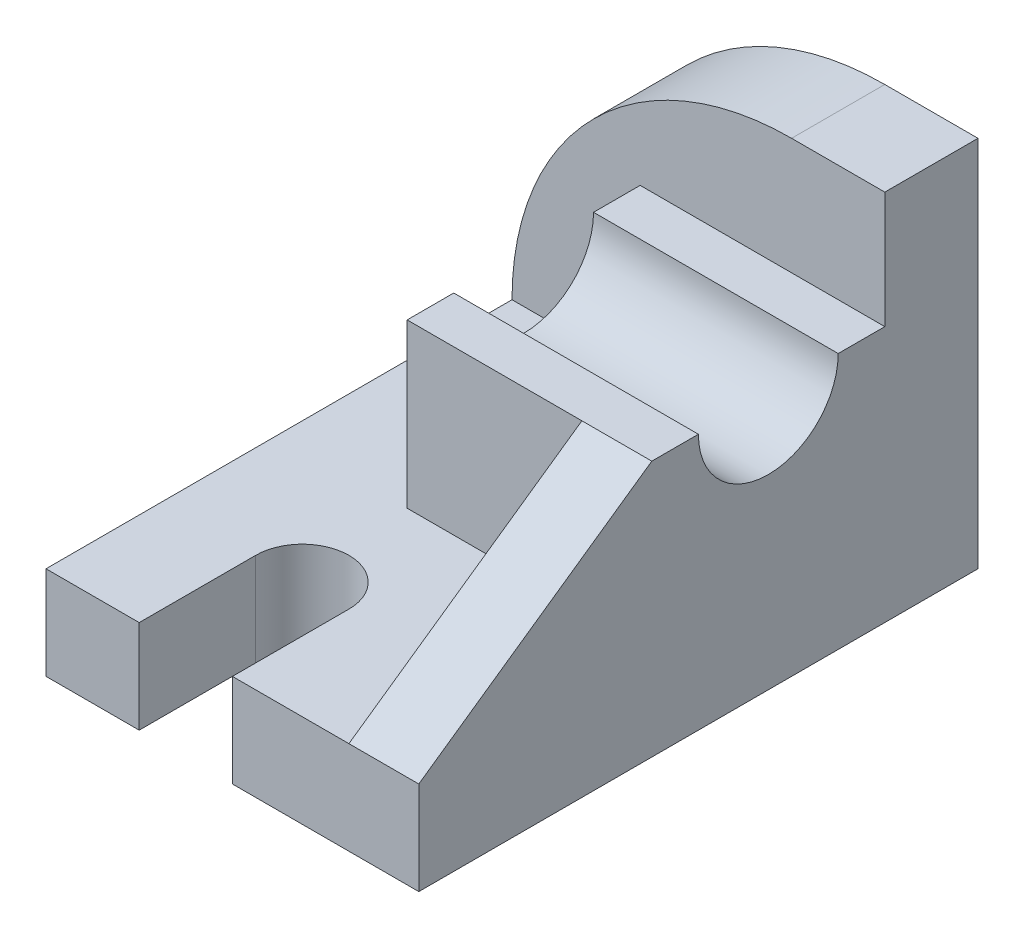
ISO-10303-21;
HEADER;
FILE_DESCRIPTION(('STEP AP214'),'2;1');
FILE_NAME('part.step','',(''),(''),'','','');
FILE_SCHEMA(('AUTOMOTIVE_DESIGN { 1 0 10303 214 1 1 1 1 }'));
ENDSEC;
DATA;
#1=APPLICATION_CONTEXT('core data for automotive mechanical design processes');
#2=APPLICATION_PROTOCOL_DEFINITION('international standard','automotive_design',2000,#1);
#3=PRODUCT_CONTEXT('',#1,'mechanical');
#4=PRODUCT('Part','Part','',(#3));
#5=PRODUCT_RELATED_PRODUCT_CATEGORY('part','',(#4));
#6=PRODUCT_DEFINITION_FORMATION('','',#4);
#7=PRODUCT_DEFINITION_CONTEXT('part definition',#1,'design');
#8=PRODUCT_DEFINITION('design','',#6,#7);
#9=PRODUCT_DEFINITION_SHAPE('','',#8);
#10=(LENGTH_UNIT() NAMED_UNIT(*) SI_UNIT(.MILLI.,.METRE.));
#11=(NAMED_UNIT(*) PLANE_ANGLE_UNIT() SI_UNIT($,.RADIAN.));
#12=(NAMED_UNIT(*) SI_UNIT($,.STERADIAN.) SOLID_ANGLE_UNIT());
#13=UNCERTAINTY_MEASURE_WITH_UNIT(LENGTH_MEASURE(1.E-05),#10,'distance_accuracy_value','');
#14=(GEOMETRIC_REPRESENTATION_CONTEXT(3) GLOBAL_UNCERTAINTY_ASSIGNED_CONTEXT((#13)) GLOBAL_UNIT_ASSIGNED_CONTEXT((#10,
#11,#12)) REPRESENTATION_CONTEXT('',''));
#15=CARTESIAN_POINT('',(0.,0.,0.));
#16=DIRECTION('',(0.,0.,1.));
#17=DIRECTION('',(1.,0.,0.));
#18=AXIS2_PLACEMENT_3D('',#15,#16,#17);
#19=CARTESIAN_POINT('',(22.,44.,-80.));
#20=DIRECTION('',(0.,1.,0.));
#21=DIRECTION('',(0.,0.,1.));
#22=AXIS2_PLACEMENT_3D('',#19,#20,#21);
#23=PLANE('',#22);
#24=DIRECTION('',(-1.,0.,0.));
#25=VECTOR('',#24,1.);
#26=CARTESIAN_POINT('',(64.,44.,-72.));
#27=LINE('',#26,#25);
#28=CARTESIAN_POINT('',(64.,44.,-72.));
#29=VERTEX_POINT('',#28);
#30=CARTESIAN_POINT('',(22.,44.,-72.));
#31=VERTEX_POINT('',#30);
#32=EDGE_CURVE('E49',#29,#31,#27,.T.);
#33=ORIENTED_EDGE('',*,*,#32,.F.);
#34=DIRECTION('',(0.,0.,1.));
#35=VECTOR('',#34,1.);
#36=CARTESIAN_POINT('',(64.,44.,-80.));
#37=LINE('',#36,#35);
#38=CARTESIAN_POINT('',(64.,44.,-80.));
#39=VERTEX_POINT('',#38);
#40=EDGE_CURVE('E298',#39,#29,#37,.T.);
#41=ORIENTED_EDGE('',*,*,#40,.F.);
#42=DIRECTION('',(1.,0.,0.));
#43=VECTOR('',#42,1.);
#44=CARTESIAN_POINT('',(22.,44.,-80.));
#45=LINE('',#44,#43);
#46=CARTESIAN_POINT('',(22.,44.,-80.));
#47=VERTEX_POINT('',#46);
#48=EDGE_CURVE('E292',#47,#39,#45,.T.);
#49=ORIENTED_EDGE('',*,*,#48,.F.);
#50=DIRECTION('',(0.,0.,1.));
#51=VECTOR('',#50,1.);
#52=CARTESIAN_POINT('',(22.,44.,-80.));
#53=LINE('',#52,#51);
#54=EDGE_CURVE('E305',#47,#31,#53,.T.);
#55=ORIENTED_EDGE('',*,*,#54,.T.);
#56=EDGE_LOOP('',(#33,#41,#49,#55));
#57=FACE_BOUND('',#56,.T.);
#58=ADVANCED_FACE('F34',(#57),#23,.T.);
#59=CARTESIAN_POINT('',(0.,16.,0.));
#60=DIRECTION('',(0.,-1.,0.));
#61=DIRECTION('',(0.,0.,-1.));
#62=AXIS2_PLACEMENT_3D('',#59,#60,#61);
#63=PLANE('',#62);
#64=DIRECTION('',(1.,0.,0.));
#65=VECTOR('',#64,1.);
#66=CARTESIAN_POINT('',(0.,16.,0.));
#67=LINE('',#66,#65);
#68=CARTESIAN_POINT('',(32.,16.,0.));
#69=VERTEX_POINT('',#68);
#70=CARTESIAN_POINT('',(52.,16.,0.));
#71=VERTEX_POINT('',#70);
#72=EDGE_CURVE('E175',#69,#71,#67,.T.);
#73=ORIENTED_EDGE('',*,*,#72,.T.);
#74=DIRECTION('',(0.,0.,-1.));
#75=VECTOR('',#74,1.);
#76=CARTESIAN_POINT('',(52.,16.,0.));
#77=LINE('',#76,#75);
#78=CARTESIAN_POINT('',(52.,16.,-40.));
#79=VERTEX_POINT('',#78);
#80=EDGE_CURVE('E150',#71,#79,#77,.T.);
#81=ORIENTED_EDGE('',*,*,#80,.T.);
#82=DIRECTION('',(1.,0.,0.));
#83=VECTOR('',#82,1.);
#84=CARTESIAN_POINT('',(22.,16.,-40.));
#85=LINE('',#84,#83);
#86=CARTESIAN_POINT('',(22.,16.,-40.));
#87=VERTEX_POINT('',#86);
#88=EDGE_CURVE('E261',#87,#79,#85,.T.);
#89=ORIENTED_EDGE('',*,*,#88,.F.);
#90=DIRECTION('',(0.,0.,-1.));
#91=VECTOR('',#90,1.);
#92=CARTESIAN_POINT('',(22.,16.,-80.));
#93=LINE('',#92,#91);
#94=CARTESIAN_POINT('',(22.,16.,-80.));
#95=VERTEX_POINT('',#94);
#96=EDGE_CURVE('E278',#87,#95,#93,.T.);
#97=ORIENTED_EDGE('',*,*,#96,.T.);
#98=DIRECTION('',(1.,0.,0.));
#99=VECTOR('',#98,1.);
#100=CARTESIAN_POINT('',(0.,16.,-80.));
#101=LINE('',#100,#99);
#102=CARTESIAN_POINT('',(0.,15.9999999999997,-80.));
#103=VERTEX_POINT('',#102);
#104=EDGE_CURVE('E267',#103,#95,#101,.T.);
#105=ORIENTED_EDGE('',*,*,#104,.F.);
#106=DIRECTION('',(0.,0.,1.));
#107=VECTOR('',#106,1.);
#108=CARTESIAN_POINT('',(0.,16.,0.));
#109=LINE('',#108,#107);
#110=CARTESIAN_POINT('',(0.,16.,0.));
#111=VERTEX_POINT('',#110);
#112=EDGE_CURVE('E189',#103,#111,#109,.T.);
#113=ORIENTED_EDGE('',*,*,#112,.T.);
#114=CARTESIAN_POINT('',(16.,16.,0.));
#115=VERTEX_POINT('',#114);
#116=EDGE_CURVE('E183',#111,#115,#67,.T.);
#117=ORIENTED_EDGE('',*,*,#116,.T.);
#118=DIRECTION('',(0.,0.,1.));
#119=VECTOR('',#118,1.);
#120=CARTESIAN_POINT('',(16.,16.,0.));
#121=LINE('',#120,#119);
#122=CARTESIAN_POINT('',(16.,16.,-20.));
#123=VERTEX_POINT('',#122);
#124=EDGE_CURVE('E237',#123,#115,#121,.T.);
#125=ORIENTED_EDGE('',*,*,#124,.F.);
#126=CARTESIAN_POINT('',(24.,16.,-20.));
#127=DIRECTION('',(0.,1.,0.));
#128=DIRECTION('',(0.,0.,1.));
#129=AXIS2_PLACEMENT_3D('',#126,#127,#128);
#130=CIRCLE('',#129,8.);
#131=CARTESIAN_POINT('',(32.,16.,-20.));
#132=VERTEX_POINT('',#131);
#133=EDGE_CURVE('E229',#132,#123,#130,.T.);
#134=ORIENTED_EDGE('',*,*,#133,.F.);
#135=DIRECTION('',(0.,0.,-1.));
#136=VECTOR('',#135,1.);
#137=CARTESIAN_POINT('',(32.,16.,0.));
#138=LINE('',#137,#136);
#139=EDGE_CURVE('E182',#69,#132,#138,.T.);
#140=ORIENTED_EDGE('',*,*,#139,.F.);
#141=EDGE_LOOP('',(#73,#81,#89,#97,#105,#113,#117,#125,#134,#140));
#142=FACE_BOUND('',#141,.T.);
#143=ADVANCED_FACE('F180',(#142),#63,.F.);
#144=CARTESIAN_POINT('',(0.,16.,0.));
#145=DIRECTION('',(0.,0.,-1.));
#146=DIRECTION('',(-1.,0.,0.));
#147=AXIS2_PLACEMENT_3D('',#144,#145,#146);
#148=PLANE('',#147);
#149=DIRECTION('',(0.,-1.,0.));
#150=VECTOR('',#149,1.);
#151=CARTESIAN_POINT('',(32.,16.,0.));
#152=LINE('',#151,#150);
#153=CARTESIAN_POINT('',(32.,0.,0.));
#154=VERTEX_POINT('',#153);
#155=EDGE_CURVE('E196',#69,#154,#152,.T.);
#156=ORIENTED_EDGE('',*,*,#155,.T.);
#157=DIRECTION('',(1.,0.,0.));
#158=VECTOR('',#157,1.);
#159=CARTESIAN_POINT('',(0.,0.,0.));
#160=LINE('',#159,#158);
#161=CARTESIAN_POINT('',(64.,0.,0.));
#162=VERTEX_POINT('',#161);
#163=EDGE_CURVE('E195',#154,#162,#160,.T.);
#164=ORIENTED_EDGE('',*,*,#163,.T.);
#165=DIRECTION('',(0.,-1.,0.));
#166=VECTOR('',#165,1.);
#167=CARTESIAN_POINT('',(64.,16.,0.));
#168=LINE('',#167,#166);
#169=CARTESIAN_POINT('',(64.,16.,0.));
#170=VERTEX_POINT('',#169);
#171=EDGE_CURVE('E177',#170,#162,#168,.T.);
#172=ORIENTED_EDGE('',*,*,#171,.F.);
#173=DIRECTION('',(1.,0.,0.));
#174=VECTOR('',#173,1.);
#175=CARTESIAN_POINT('',(52.,16.,0.));
#176=LINE('',#175,#174);
#177=EDGE_CURVE('E164',#71,#170,#176,.T.);
#178=ORIENTED_EDGE('',*,*,#177,.F.);
#179=ORIENTED_EDGE('',*,*,#72,.F.);
#180=EDGE_LOOP('',(#156,#164,#172,#178,#179));
#181=FACE_BOUND('',#180,.T.);
#182=ADVANCED_FACE('F174',(#181),#148,.F.);
#183=DIRECTION('',(0.,-1.,0.));
#184=VECTOR('',#183,1.);
#185=CARTESIAN_POINT('',(16.,16.,0.));
#186=LINE('',#185,#184);
#187=CARTESIAN_POINT('',(16.,0.,0.));
#188=VERTEX_POINT('',#187);
#189=EDGE_CURVE('E56',#115,#188,#186,.T.);
#190=ORIENTED_EDGE('',*,*,#189,.F.);
#191=ORIENTED_EDGE('',*,*,#116,.F.);
#192=DIRECTION('',(0.,-1.,0.));
#193=VECTOR('',#192,1.);
#194=CARTESIAN_POINT('',(0.,16.,0.));
#195=LINE('',#194,#193);
#196=CARTESIAN_POINT('',(0.,0.,0.));
#197=VERTEX_POINT('',#196);
#198=EDGE_CURVE('E42',#111,#197,#195,.T.);
#199=ORIENTED_EDGE('',*,*,#198,.T.);
#200=EDGE_CURVE('E197',#197,#188,#160,.T.);
#201=ORIENTED_EDGE('',*,*,#200,.T.);
#202=EDGE_LOOP('',(#190,#191,#199,#201));
#203=FACE_BOUND('',#202,.T.);
#204=ADVANCED_FACE('F213',(#203),#148,.F.);
#205=CARTESIAN_POINT('',(0.,0.,0.));
#206=DIRECTION('',(0.,-1.,0.));
#207=DIRECTION('',(0.,0.,-1.));
#208=AXIS2_PLACEMENT_3D('',#205,#206,#207);
#209=PLANE('',#208);
#210=DIRECTION('',(-1.,0.,0.));
#211=VECTOR('',#210,1.);
#212=CARTESIAN_POINT('',(0.,0.,-96.));
#213=LINE('',#212,#211);
#214=CARTESIAN_POINT('',(64.,0.,-96.));
#215=VERTEX_POINT('',#214);
#216=CARTESIAN_POINT('',(0.,0.,-96.));
#217=VERTEX_POINT('',#216);
#218=EDGE_CURVE('E202',#215,#217,#213,.T.);
#219=ORIENTED_EDGE('',*,*,#218,.F.);
#220=DIRECTION('',(0.,0.,-1.));
#221=VECTOR('',#220,1.);
#222=CARTESIAN_POINT('',(64.,0.,0.));
#223=LINE('',#222,#221);
#224=EDGE_CURVE('E200',#162,#215,#223,.T.);
#225=ORIENTED_EDGE('',*,*,#224,.F.);
#226=ORIENTED_EDGE('',*,*,#163,.F.);
#227=DIRECTION('',(0.,0.,-1.));
#228=VECTOR('',#227,1.);
#229=CARTESIAN_POINT('',(32.,0.,0.));
#230=LINE('',#229,#228);
#231=CARTESIAN_POINT('',(32.,0.,-20.));
#232=VERTEX_POINT('',#231);
#233=EDGE_CURVE('E231',#154,#232,#230,.T.);
#234=ORIENTED_EDGE('',*,*,#233,.T.);
#235=CARTESIAN_POINT('',(24.,0.,-20.));
#236=DIRECTION('',(0.,1.,0.));
#237=DIRECTION('',(0.,0.,1.));
#238=AXIS2_PLACEMENT_3D('',#235,#236,#237);
#239=CIRCLE('',#238,8.);
#240=CARTESIAN_POINT('',(16.,0.,-20.));
#241=VERTEX_POINT('',#240);
#242=EDGE_CURVE('E226',#232,#241,#239,.T.);
#243=ORIENTED_EDGE('',*,*,#242,.T.);
#244=DIRECTION('',(0.,0.,1.));
#245=VECTOR('',#244,1.);
#246=CARTESIAN_POINT('',(16.,0.,0.));
#247=LINE('',#246,#245);
#248=EDGE_CURVE('E223',#241,#188,#247,.T.);
#249=ORIENTED_EDGE('',*,*,#248,.T.);
#250=ORIENTED_EDGE('',*,*,#200,.F.);
#251=DIRECTION('',(0.,0.,1.));
#252=VECTOR('',#251,1.);
#253=CARTESIAN_POINT('',(0.,0.,0.));
#254=LINE('',#253,#252);
#255=EDGE_CURVE('E193',#217,#197,#254,.T.);
#256=ORIENTED_EDGE('',*,*,#255,.F.);
#257=EDGE_LOOP('',(#219,#225,#226,#234,#243,#249,#250,#256));
#258=FACE_BOUND('',#257,.T.);
#259=ADVANCED_FACE('F221',(#258),#209,.T.);
#260=CARTESIAN_POINT('',(0.,16.,0.));
#261=DIRECTION('',(1.,0.,0.));
#262=DIRECTION('',(0.,0.,-1.));
#263=AXIS2_PLACEMENT_3D('',#260,#261,#262);
#264=PLANE('',#263);
#265=ORIENTED_EDGE('',*,*,#255,.T.);
#266=ORIENTED_EDGE('',*,*,#198,.F.);
#267=ORIENTED_EDGE('',*,*,#112,.F.);
#268=CARTESIAN_POINT('',(0.,16.,-96.));
#269=VERTEX_POINT('',#268);
#270=EDGE_CURVE('E184',#269,#103,#109,.T.);
#271=ORIENTED_EDGE('',*,*,#270,.F.);
#272=DIRECTION('',(0.,-1.,0.));
#273=VECTOR('',#272,1.);
#274=CARTESIAN_POINT('',(0.,16.,-96.));
#275=LINE('',#274,#273);
#276=EDGE_CURVE('E187',#269,#217,#275,.T.);
#277=ORIENTED_EDGE('',*,*,#276,.T.);
#278=EDGE_LOOP('',(#265,#266,#267,#271,#277));
#279=FACE_BOUND('',#278,.T.);
#280=ADVANCED_FACE('F36',(#279),#264,.F.);
#281=CARTESIAN_POINT('',(64.,16.,0.));
#282=DIRECTION('',(-1.,0.,0.));
#283=DIRECTION('',(0.,0.,1.));
#284=AXIS2_PLACEMENT_3D('',#281,#282,#283);
#285=PLANE('',#284);
#286=ORIENTED_EDGE('',*,*,#40,.T.);
#287=CARTESIAN_POINT('',(64.,44.,-60.));
#288=DIRECTION('',(-1.,0.,0.));
#289=DIRECTION('',(0.,0.,1.));
#290=AXIS2_PLACEMENT_3D('',#287,#288,#289);
#291=CIRCLE('',#290,12.);
#292=CARTESIAN_POINT('',(64.,44.,-48.));
#293=VERTEX_POINT('',#292);
#294=EDGE_CURVE('E313',#29,#293,#291,.T.);
#295=ORIENTED_EDGE('',*,*,#294,.T.);
#296=CARTESIAN_POINT('',(64.,44.,-40.));
#297=VERTEX_POINT('',#296);
#298=EDGE_CURVE('E301',#293,#297,#37,.T.);
#299=ORIENTED_EDGE('',*,*,#298,.T.);
#300=DIRECTION('',(0.,-0.573462344363328,0.819231920519041));
#301=VECTOR('',#300,1.);
#302=CARTESIAN_POINT('',(64.,44.,-40.));
#303=LINE('',#302,#301);
#304=EDGE_CURVE('E168',#297,#170,#303,.T.);
#305=ORIENTED_EDGE('',*,*,#304,.T.);
#306=ORIENTED_EDGE('',*,*,#171,.T.);
#307=ORIENTED_EDGE('',*,*,#224,.T.);
#308=DIRECTION('',(0.,-1.,0.));
#309=VECTOR('',#308,1.);
#310=CARTESIAN_POINT('',(64.,16.,-96.));
#311=LINE('',#310,#309);
#312=CARTESIAN_POINT('',(64.,64.,-96.));
#313=VERTEX_POINT('',#312);
#314=EDGE_CURVE('E206',#313,#215,#311,.T.);
#315=ORIENTED_EDGE('',*,*,#314,.F.);
#316=DIRECTION('',(0.,0.,-1.));
#317=VECTOR('',#316,1.);
#318=CARTESIAN_POINT('',(64.,64.,-80.));
#319=LINE('',#318,#317);
#320=CARTESIAN_POINT('',(64.,64.,-80.));
#321=VERTEX_POINT('',#320);
#322=EDGE_CURVE('E265',#321,#313,#319,.T.);
#323=ORIENTED_EDGE('',*,*,#322,.F.);
#324=DIRECTION('',(0.,-1.,0.));
#325=VECTOR('',#324,1.);
#326=CARTESIAN_POINT('',(64.,0.,-80.));
#327=LINE('',#326,#325);
#328=EDGE_CURVE('E270',#321,#39,#327,.T.);
#329=ORIENTED_EDGE('',*,*,#328,.T.);
#330=EDGE_LOOP('',(#286,#295,#299,#305,#306,#307,#315,#323,#329));
#331=FACE_BOUND('',#330,.T.);
#332=ADVANCED_FACE('F245',(#331),#285,.F.);
#333=CARTESIAN_POINT('',(0.,16.,-96.));
#334=DIRECTION('',(0.,0.,1.));
#335=DIRECTION('',(1.,0.,0.));
#336=AXIS2_PLACEMENT_3D('',#333,#334,#335);
#337=PLANE('',#336);
#338=ORIENTED_EDGE('',*,*,#218,.T.);
#339=ORIENTED_EDGE('',*,*,#276,.F.);
#340=CARTESIAN_POINT('',(48.,16.,-96.));
#341=DIRECTION('',(0.,0.,-1.));
#342=DIRECTION('',(-1.,0.,0.));
#343=AXIS2_PLACEMENT_3D('',#340,#341,#342);
#344=CIRCLE('',#343,48.);
#345=CARTESIAN_POINT('',(48.0000000000003,64.,-96.));
#346=VERTEX_POINT('',#345);
#347=EDGE_CURVE('E254',#269,#346,#344,.T.);
#348=ORIENTED_EDGE('',*,*,#347,.T.);
#349=DIRECTION('',(1.,0.,0.));
#350=VECTOR('',#349,1.);
#351=CARTESIAN_POINT('',(48.0000000000003,64.,-96.));
#352=LINE('',#351,#350);
#353=EDGE_CURVE('E252',#346,#313,#352,.T.);
#354=ORIENTED_EDGE('',*,*,#353,.T.);
#355=ORIENTED_EDGE('',*,*,#314,.T.);
#356=EDGE_LOOP('',(#338,#339,#348,#354,#355));
#357=FACE_BOUND('',#356,.T.);
#358=ADVANCED_FACE('F249',(#357),#337,.F.);
#359=CARTESIAN_POINT('',(32.,16.,0.));
#360=DIRECTION('',(-1.,0.,0.));
#361=DIRECTION('',(0.,0.,1.));
#362=AXIS2_PLACEMENT_3D('',#359,#360,#361);
#363=PLANE('',#362);
#364=ORIENTED_EDGE('',*,*,#233,.F.);
#365=ORIENTED_EDGE('',*,*,#155,.F.);
#366=ORIENTED_EDGE('',*,*,#139,.T.);
#367=DIRECTION('',(0.,-1.,0.));
#368=VECTOR('',#367,1.);
#369=CARTESIAN_POINT('',(32.,16.,-20.));
#370=LINE('',#369,#368);
#371=EDGE_CURVE('E239',#132,#232,#370,.T.);
#372=ORIENTED_EDGE('',*,*,#371,.T.);
#373=EDGE_LOOP('',(#364,#365,#366,#372));
#374=FACE_BOUND('',#373,.T.);
#375=ADVANCED_FACE('F410',(#374),#363,.T.);
#376=CARTESIAN_POINT('',(24.,16.,-20.));
#377=DIRECTION('',(0.,-1.,0.));
#378=DIRECTION('',(0.,0.,-1.));
#379=AXIS2_PLACEMENT_3D('',#376,#377,#378);
#380=CYLINDRICAL_SURFACE('',#379,8.);
#381=ORIENTED_EDGE('',*,*,#242,.F.);
#382=ORIENTED_EDGE('',*,*,#371,.F.);
#383=ORIENTED_EDGE('',*,*,#133,.T.);
#384=DIRECTION('',(0.,-1.,0.));
#385=VECTOR('',#384,1.);
#386=CARTESIAN_POINT('',(16.,16.,-20.));
#387=LINE('',#386,#385);
#388=EDGE_CURVE('E236',#123,#241,#387,.T.);
#389=ORIENTED_EDGE('',*,*,#388,.T.);
#390=EDGE_LOOP('',(#381,#382,#383,#389));
#391=FACE_BOUND('',#390,.T.);
#392=ADVANCED_FACE('F440',(#391),#380,.F.);
#393=CARTESIAN_POINT('',(16.,16.,0.));
#394=DIRECTION('',(1.,0.,0.));
#395=DIRECTION('',(0.,0.,-1.));
#396=AXIS2_PLACEMENT_3D('',#393,#394,#395);
#397=PLANE('',#396);
#398=ORIENTED_EDGE('',*,*,#248,.F.);
#399=ORIENTED_EDGE('',*,*,#388,.F.);
#400=ORIENTED_EDGE('',*,*,#124,.T.);
#401=ORIENTED_EDGE('',*,*,#189,.T.);
#402=EDGE_LOOP('',(#398,#399,#400,#401));
#403=FACE_BOUND('',#402,.T.);
#404=ADVANCED_FACE('F275',(#403),#397,.T.);
#405=CARTESIAN_POINT('',(48.,16.,-80.));
#406=DIRECTION('',(0.,0.,-1.));
#407=DIRECTION('',(-1.,0.,0.));
#408=AXIS2_PLACEMENT_3D('',#405,#406,#407);
#409=PLANE('',#408);
#410=DIRECTION('',(0.,1.,0.));
#411=VECTOR('',#410,1.);
#412=CARTESIAN_POINT('',(22.,16.,-80.));
#413=LINE('',#412,#411);
#414=EDGE_CURVE('E300',#95,#47,#413,.T.);
#415=ORIENTED_EDGE('',*,*,#414,.T.);
#416=ORIENTED_EDGE('',*,*,#48,.T.);
#417=ORIENTED_EDGE('',*,*,#328,.F.);
#418=DIRECTION('',(1.,0.,0.));
#419=VECTOR('',#418,1.);
#420=CARTESIAN_POINT('',(48.0000000000003,64.,-80.));
#421=LINE('',#420,#419);
#422=CARTESIAN_POINT('',(48.0000000000003,64.,-80.));
#423=VERTEX_POINT('',#422);
#424=EDGE_CURVE('E259',#423,#321,#421,.T.);
#425=ORIENTED_EDGE('',*,*,#424,.F.);
#426=CARTESIAN_POINT('',(48.,16.,-80.));
#427=DIRECTION('',(0.,0.,-1.));
#428=DIRECTION('',(-1.,0.,0.));
#429=AXIS2_PLACEMENT_3D('',#426,#427,#428);
#430=CIRCLE('',#429,48.);
#431=EDGE_CURVE('E256',#103,#423,#430,.T.);
#432=ORIENTED_EDGE('',*,*,#431,.F.);
#433=ORIENTED_EDGE('',*,*,#104,.T.);
#434=EDGE_LOOP('',(#415,#416,#417,#425,#432,#433));
#435=FACE_BOUND('',#434,.T.);
#436=ADVANCED_FACE('F285',(#435),#409,.F.);
#437=CARTESIAN_POINT('',(48.0000000000003,64.,-80.));
#438=DIRECTION('',(0.,1.,0.));
#439=DIRECTION('',(0.,0.,1.));
#440=AXIS2_PLACEMENT_3D('',#437,#438,#439);
#441=PLANE('',#440);
#442=ORIENTED_EDGE('',*,*,#353,.F.);
#443=DIRECTION('',(0.,0.,-1.));
#444=VECTOR('',#443,1.);
#445=CARTESIAN_POINT('',(48.0000000000003,64.,-80.));
#446=LINE('',#445,#444);
#447=EDGE_CURVE('E268',#423,#346,#446,.T.);
#448=ORIENTED_EDGE('',*,*,#447,.F.);
#449=ORIENTED_EDGE('',*,*,#424,.T.);
#450=ORIENTED_EDGE('',*,*,#322,.T.);
#451=EDGE_LOOP('',(#442,#448,#449,#450));
#452=FACE_BOUND('',#451,.T.);
#453=ADVANCED_FACE('F332',(#452),#441,.T.);
#454=CARTESIAN_POINT('',(48.,16.,-80.));
#455=DIRECTION('',(0.,0.,-1.));
#456=DIRECTION('',(-1.,0.,0.));
#457=AXIS2_PLACEMENT_3D('',#454,#455,#456);
#458=CYLINDRICAL_SURFACE('',#457,48.);
#459=ORIENTED_EDGE('',*,*,#347,.F.);
#460=ORIENTED_EDGE('',*,*,#270,.T.);
#461=ORIENTED_EDGE('',*,*,#431,.T.);
#462=ORIENTED_EDGE('',*,*,#447,.T.);
#463=EDGE_LOOP('',(#459,#460,#461,#462));
#464=FACE_BOUND('',#463,.T.);
#465=ADVANCED_FACE('F283',(#464),#458,.T.);
#466=CARTESIAN_POINT('',(22.,16.,-40.));
#467=DIRECTION('',(0.,0.,1.));
#468=DIRECTION('',(1.,0.,0.));
#469=AXIS2_PLACEMENT_3D('',#466,#467,#468);
#470=PLANE('',#469);
#471=DIRECTION('',(0.,1.,0.));
#472=VECTOR('',#471,1.);
#473=CARTESIAN_POINT('',(52.,16.,-40.));
#474=LINE('',#473,#472);
#475=CARTESIAN_POINT('',(52.,44.,-40.));
#476=VERTEX_POINT('',#475);
#477=EDGE_CURVE('E155',#79,#476,#474,.T.);
#478=ORIENTED_EDGE('',*,*,#477,.T.);
#479=DIRECTION('',(1.,0.,0.));
#480=VECTOR('',#479,1.);
#481=CARTESIAN_POINT('',(22.,44.,-40.));
#482=LINE('',#481,#480);
#483=CARTESIAN_POINT('',(22.,44.,-40.));
#484=VERTEX_POINT('',#483);
#485=EDGE_CURVE('E294',#484,#476,#482,.T.);
#486=ORIENTED_EDGE('',*,*,#485,.F.);
#487=DIRECTION('',(0.,-1.,0.));
#488=VECTOR('',#487,1.);
#489=CARTESIAN_POINT('',(22.,16.,-40.));
#490=LINE('',#489,#488);
#491=EDGE_CURVE('E303',#484,#87,#490,.T.);
#492=ORIENTED_EDGE('',*,*,#491,.T.);
#493=ORIENTED_EDGE('',*,*,#88,.T.);
#494=EDGE_LOOP('',(#478,#486,#492,#493));
#495=FACE_BOUND('',#494,.T.);
#496=ADVANCED_FACE('F320',(#495),#470,.T.);
#497=DIRECTION('',(-1.,0.,0.));
#498=VECTOR('',#497,1.);
#499=CARTESIAN_POINT('',(64.,44.,-48.));
#500=LINE('',#499,#498);
#501=CARTESIAN_POINT('',(22.,44.,-48.));
#502=VERTEX_POINT('',#501);
#503=EDGE_CURVE('E311',#502,#293,#500,.F.);
#504=ORIENTED_EDGE('',*,*,#503,.F.);
#505=EDGE_CURVE('E308',#502,#484,#53,.T.);
#506=ORIENTED_EDGE('',*,*,#505,.T.);
#507=ORIENTED_EDGE('',*,*,#485,.T.);
#508=DIRECTION('',(1.,0.,0.));
#509=VECTOR('',#508,1.);
#510=CARTESIAN_POINT('',(52.,44.,-40.));
#511=LINE('',#510,#509);
#512=EDGE_CURVE('E167',#476,#297,#511,.T.);
#513=ORIENTED_EDGE('',*,*,#512,.T.);
#514=ORIENTED_EDGE('',*,*,#298,.F.);
#515=EDGE_LOOP('',(#504,#506,#507,#513,#514));
#516=FACE_BOUND('',#515,.T.);
#517=ADVANCED_FACE('F324',(#516),#23,.T.);
#518=CARTESIAN_POINT('',(22.,0.,0.));
#519=DIRECTION('',(1.,0.,0.));
#520=DIRECTION('',(0.,0.,-1.));
#521=AXIS2_PLACEMENT_3D('',#518,#519,#520);
#522=PLANE('',#521);
#523=ORIENTED_EDGE('',*,*,#505,.F.);
#524=CARTESIAN_POINT('',(22.,44.,-60.));
#525=DIRECTION('',(1.,0.,0.));
#526=DIRECTION('',(0.,0.,-1.));
#527=AXIS2_PLACEMENT_3D('',#524,#525,#526);
#528=CIRCLE('',#527,12.);
#529=EDGE_CURVE('E11',#502,#31,#528,.T.);
#530=ORIENTED_EDGE('',*,*,#529,.T.);
#531=ORIENTED_EDGE('',*,*,#54,.F.);
#532=ORIENTED_EDGE('',*,*,#414,.F.);
#533=ORIENTED_EDGE('',*,*,#96,.F.);
#534=ORIENTED_EDGE('',*,*,#491,.F.);
#535=EDGE_LOOP('',(#523,#530,#531,#532,#533,#534));
#536=FACE_BOUND('',#535,.T.);
#537=ADVANCED_FACE('F329',(#536),#522,.F.);
#538=CARTESIAN_POINT('',(64.,44.,-60.));
#539=DIRECTION('',(-1.,0.,0.));
#540=DIRECTION('',(0.,0.,1.));
#541=AXIS2_PLACEMENT_3D('',#538,#539,#540);
#542=CYLINDRICAL_SURFACE('',#541,12.);
#543=ORIENTED_EDGE('',*,*,#32,.T.);
#544=ORIENTED_EDGE('',*,*,#529,.F.);
#545=ORIENTED_EDGE('',*,*,#503,.T.);
#546=ORIENTED_EDGE('',*,*,#294,.F.);
#547=EDGE_LOOP('',(#543,#544,#545,#546));
#548=FACE_BOUND('',#547,.T.);
#549=ADVANCED_FACE('F353',(#548),#542,.F.);
#550=CARTESIAN_POINT('',(52.,44.,-40.));
#551=DIRECTION('',(0.,0.81923192051904,0.573462344363328));
#552=DIRECTION('',(0.,-0.573462344363328,0.819231920519041));
#553=AXIS2_PLACEMENT_3D('',#550,#551,#552);
#554=PLANE('',#553);
#555=ORIENTED_EDGE('',*,*,#304,.F.);
#556=ORIENTED_EDGE('',*,*,#512,.F.);
#557=DIRECTION('',(0.,-0.573462344363328,0.819231920519041));
#558=VECTOR('',#557,1.);
#559=CARTESIAN_POINT('',(52.,44.,-40.));
#560=LINE('',#559,#558);
#561=EDGE_CURVE('E153',#476,#71,#560,.T.);
#562=ORIENTED_EDGE('',*,*,#561,.T.);
#563=ORIENTED_EDGE('',*,*,#177,.T.);
#564=EDGE_LOOP('',(#555,#556,#562,#563));
#565=FACE_BOUND('',#564,.T.);
#566=ADVANCED_FACE('F163',(#565),#554,.T.);
#567=CARTESIAN_POINT('',(52.,0.,0.));
#568=DIRECTION('',(-1.,0.,0.));
#569=DIRECTION('',(0.,0.,1.));
#570=AXIS2_PLACEMENT_3D('',#567,#568,#569);
#571=PLANE('',#570);
#572=ORIENTED_EDGE('',*,*,#561,.F.);
#573=ORIENTED_EDGE('',*,*,#477,.F.);
#574=ORIENTED_EDGE('',*,*,#80,.F.);
#575=EDGE_LOOP('',(#572,#573,#574));
#576=FACE_BOUND('',#575,.T.);
#577=ADVANCED_FACE('F152',(#576),#571,.T.);
#578=CLOSED_SHELL('',(#58,#143,#182,#204,#259,#280,#332,#358,#375,#392,#404,#436,#453,#465,#496,
#517,#537,#549,#566,#577));
#579=MANIFOLD_SOLID_BREP('B2',#578);
#580=ADVANCED_BREP_SHAPE_REPRESENTATION('',(#18,#579),#14);
#581=SHAPE_DEFINITION_REPRESENTATION(#9,#580);
ENDSEC;
END-ISO-10303-21;
